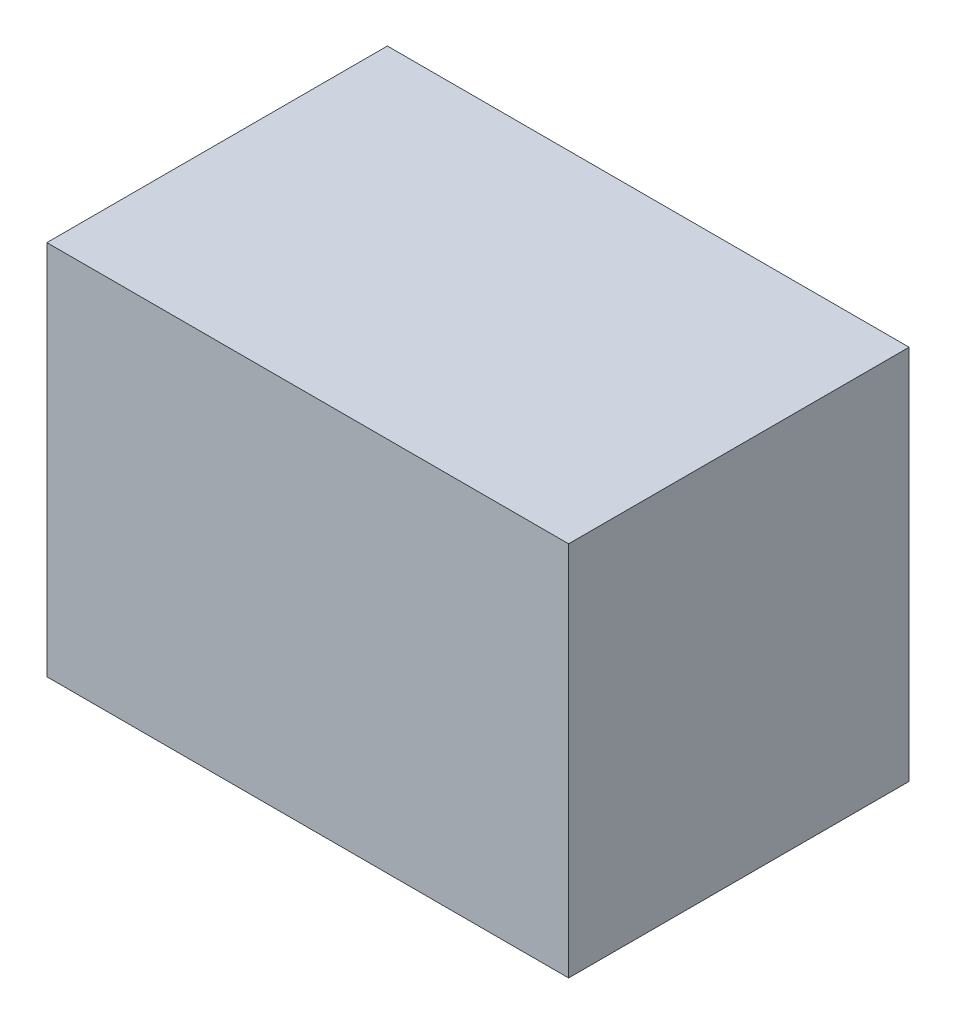
ISO-10303-21;
HEADER;
FILE_DESCRIPTION(('STEP AP214'),'2;1');
FILE_NAME('part.step','',(''),(''),'','','');
FILE_SCHEMA(('AUTOMOTIVE_DESIGN { 1 0 10303 214 1 1 1 1 }'));
ENDSEC;
DATA;
#1=APPLICATION_CONTEXT('core data for automotive mechanical design processes');
#2=APPLICATION_PROTOCOL_DEFINITION('international standard','automotive_design',2000,#1);
#3=PRODUCT_CONTEXT('',#1,'mechanical');
#4=PRODUCT('Part','Part','',(#3));
#5=PRODUCT_RELATED_PRODUCT_CATEGORY('part','',(#4));
#6=PRODUCT_DEFINITION_FORMATION('','',#4);
#7=PRODUCT_DEFINITION_CONTEXT('part definition',#1,'design');
#8=PRODUCT_DEFINITION('design','',#6,#7);
#9=PRODUCT_DEFINITION_SHAPE('','',#8);
#10=(LENGTH_UNIT() NAMED_UNIT(*) SI_UNIT(.MILLI.,.METRE.));
#11=(NAMED_UNIT(*) PLANE_ANGLE_UNIT() SI_UNIT($,.RADIAN.));
#12=(NAMED_UNIT(*) SI_UNIT($,.STERADIAN.) SOLID_ANGLE_UNIT());
#13=UNCERTAINTY_MEASURE_WITH_UNIT(LENGTH_MEASURE(1.E-05),#10,'distance_accuracy_value','');
#14=(GEOMETRIC_REPRESENTATION_CONTEXT(3) GLOBAL_UNCERTAINTY_ASSIGNED_CONTEXT((#13)) GLOBAL_UNIT_ASSIGNED_CONTEXT((#10,
#11,#12)) REPRESENTATION_CONTEXT('',''));
#15=CARTESIAN_POINT('',(0.,0.,0.));
#16=DIRECTION('',(0.,0.,1.));
#17=DIRECTION('',(1.,0.,0.));
#18=AXIS2_PLACEMENT_3D('',#15,#16,#17);
#19=CARTESIAN_POINT('',(-3.52425,-2.54,4.60000096));
#20=DIRECTION('',(0.,0.,1.));
#21=DIRECTION('',(1.,0.,0.));
#22=AXIS2_PLACEMENT_3D('',#19,#20,#21);
#23=PLANE('',#22);
#24=DIRECTION('',(1.,0.,0.));
#25=VECTOR('',#24,1.);
#26=CARTESIAN_POINT('',(-3.52425,2.54,4.60000096));
#27=LINE('',#26,#25);
#28=CARTESIAN_POINT('',(-3.52425,2.54,4.60000096));
#29=VERTEX_POINT('',#28);
#30=CARTESIAN_POINT('',(3.52425,2.54,4.60000096));
#31=VERTEX_POINT('',#30);
#32=EDGE_CURVE('E53',#29,#31,#27,.T.);
#33=ORIENTED_EDGE('',*,*,#32,.F.);
#34=DIRECTION('',(0.,1.,0.));
#35=VECTOR('',#34,1.);
#36=CARTESIAN_POINT('',(-3.52425,-2.54,4.60000096));
#37=LINE('',#36,#35);
#38=CARTESIAN_POINT('',(-3.52425,-2.54,4.60000096));
#39=VERTEX_POINT('',#38);
#40=EDGE_CURVE('E68',#39,#29,#37,.T.);
#41=ORIENTED_EDGE('',*,*,#40,.F.);
#42=DIRECTION('',(1.,0.,0.));
#43=VECTOR('',#42,1.);
#44=CARTESIAN_POINT('',(3.52425,-2.54,4.60000096));
#45=LINE('',#44,#43);
#46=CARTESIAN_POINT('',(3.52425,-2.54,4.60000096));
#47=VERTEX_POINT('',#46);
#48=EDGE_CURVE('E20',#47,#39,#45,.F.);
#49=ORIENTED_EDGE('',*,*,#48,.F.);
#50=DIRECTION('',(0.,1.,0.));
#51=VECTOR('',#50,1.);
#52=CARTESIAN_POINT('',(3.52425,2.54,4.60000096));
#53=LINE('',#52,#51);
#54=EDGE_CURVE('E58',#31,#47,#53,.F.);
#55=ORIENTED_EDGE('',*,*,#54,.F.);
#56=EDGE_LOOP('',(#33,#41,#49,#55));
#57=FACE_BOUND('',#56,.T.);
#58=ADVANCED_FACE('F17',(#57),#23,.T.);
#59=CARTESIAN_POINT('',(3.52425,-2.54,0.));
#60=DIRECTION('',(0.,-1.,0.));
#61=DIRECTION('',(0.,0.,-1.));
#62=AXIS2_PLACEMENT_3D('',#59,#60,#61);
#63=PLANE('',#62);
#64=DIRECTION('',(0.,0.,1.));
#65=VECTOR('',#64,1.);
#66=CARTESIAN_POINT('',(-3.52425,-2.54,0.));
#67=LINE('',#66,#65);
#68=CARTESIAN_POINT('',(-3.52425,-2.54,0.));
#69=VERTEX_POINT('',#68);
#70=EDGE_CURVE('E79',#69,#39,#67,.T.);
#71=ORIENTED_EDGE('',*,*,#70,.F.);
#72=DIRECTION('',(1.,0.,0.));
#73=VECTOR('',#72,1.);
#74=CARTESIAN_POINT('',(-3.52425,-2.54,0.));
#75=LINE('',#74,#73);
#76=CARTESIAN_POINT('',(3.52425,-2.54,0.));
#77=VERTEX_POINT('',#76);
#78=EDGE_CURVE('E74',#69,#77,#75,.T.);
#79=ORIENTED_EDGE('',*,*,#78,.T.);
#80=DIRECTION('',(0.,0.,-1.));
#81=VECTOR('',#80,1.);
#82=CARTESIAN_POINT('',(3.52425,-2.54,0.));
#83=LINE('',#82,#81);
#84=EDGE_CURVE('E63',#47,#77,#83,.T.);
#85=ORIENTED_EDGE('',*,*,#84,.F.);
#86=ORIENTED_EDGE('',*,*,#48,.T.);
#87=EDGE_LOOP('',(#71,#79,#85,#86));
#88=FACE_BOUND('',#87,.T.);
#89=ADVANCED_FACE('F73',(#88),#63,.T.);
#90=CARTESIAN_POINT('',(3.52425,2.54,0.));
#91=DIRECTION('',(1.,0.,0.));
#92=DIRECTION('',(0.,0.,-1.));
#93=AXIS2_PLACEMENT_3D('',#90,#91,#92);
#94=PLANE('',#93);
#95=ORIENTED_EDGE('',*,*,#84,.T.);
#96=DIRECTION('',(0.,1.,0.));
#97=VECTOR('',#96,1.);
#98=CARTESIAN_POINT('',(3.52425,-2.54,0.));
#99=LINE('',#98,#97);
#100=CARTESIAN_POINT('',(3.52425,2.54,0.));
#101=VERTEX_POINT('',#100);
#102=EDGE_CURVE('E84',#77,#101,#99,.T.);
#103=ORIENTED_EDGE('',*,*,#102,.T.);
#104=DIRECTION('',(0.,0.,1.));
#105=VECTOR('',#104,1.);
#106=CARTESIAN_POINT('',(3.52425,2.54,0.));
#107=LINE('',#106,#105);
#108=EDGE_CURVE('E65',#31,#101,#107,.F.);
#109=ORIENTED_EDGE('',*,*,#108,.F.);
#110=ORIENTED_EDGE('',*,*,#54,.T.);
#111=EDGE_LOOP('',(#95,#103,#109,#110));
#112=FACE_BOUND('',#111,.T.);
#113=ADVANCED_FACE('F60',(#112),#94,.T.);
#114=CARTESIAN_POINT('',(-3.52425,2.54,0.));
#115=DIRECTION('',(0.,1.,0.));
#116=DIRECTION('',(0.,0.,1.));
#117=AXIS2_PLACEMENT_3D('',#114,#115,#116);
#118=PLANE('',#117);
#119=ORIENTED_EDGE('',*,*,#108,.T.);
#120=DIRECTION('',(1.,0.,0.));
#121=VECTOR('',#120,1.);
#122=CARTESIAN_POINT('',(-3.52425,2.54,0.));
#123=LINE('',#122,#121);
#124=CARTESIAN_POINT('',(-3.52425,2.54,0.));
#125=VERTEX_POINT('',#124);
#126=EDGE_CURVE('E26',#101,#125,#123,.F.);
#127=ORIENTED_EDGE('',*,*,#126,.T.);
#128=DIRECTION('',(0.,0.,1.));
#129=VECTOR('',#128,1.);
#130=CARTESIAN_POINT('',(-3.52425,2.54,0.));
#131=LINE('',#130,#129);
#132=EDGE_CURVE('E34',#29,#125,#131,.F.);
#133=ORIENTED_EDGE('',*,*,#132,.F.);
#134=ORIENTED_EDGE('',*,*,#32,.T.);
#135=EDGE_LOOP('',(#119,#127,#133,#134));
#136=FACE_BOUND('',#135,.T.);
#137=ADVANCED_FACE('F88',(#136),#118,.T.);
#138=CARTESIAN_POINT('',(-3.52425,-2.54,0.));
#139=DIRECTION('',(-1.,0.,0.));
#140=DIRECTION('',(0.,0.,1.));
#141=AXIS2_PLACEMENT_3D('',#138,#139,#140);
#142=PLANE('',#141);
#143=ORIENTED_EDGE('',*,*,#132,.T.);
#144=DIRECTION('',(0.,1.,0.));
#145=VECTOR('',#144,1.);
#146=CARTESIAN_POINT('',(-3.52425,-2.54,0.));
#147=LINE('',#146,#145);
#148=EDGE_CURVE('E11',#125,#69,#147,.F.);
#149=ORIENTED_EDGE('',*,*,#148,.T.);
#150=ORIENTED_EDGE('',*,*,#70,.T.);
#151=ORIENTED_EDGE('',*,*,#40,.T.);
#152=EDGE_LOOP('',(#143,#149,#150,#151));
#153=FACE_BOUND('',#152,.T.);
#154=ADVANCED_FACE('F91',(#153),#142,.T.);
#155=CARTESIAN_POINT('',(-3.52425,-2.54,0.));
#156=DIRECTION('',(0.,0.,1.));
#157=DIRECTION('',(1.,0.,0.));
#158=AXIS2_PLACEMENT_3D('',#155,#156,#157);
#159=PLANE('',#158);
#160=ORIENTED_EDGE('',*,*,#126,.F.);
#161=ORIENTED_EDGE('',*,*,#102,.F.);
#162=ORIENTED_EDGE('',*,*,#78,.F.);
#163=ORIENTED_EDGE('',*,*,#148,.F.);
#164=EDGE_LOOP('',(#160,#161,#162,#163));
#165=FACE_BOUND('',#164,.T.);
#166=ADVANCED_FACE('F90',(#165),#159,.F.);
#167=CLOSED_SHELL('',(#58,#89,#113,#137,#154,#166));
#168=MANIFOLD_SOLID_BREP('B1',#167);
#169=ADVANCED_BREP_SHAPE_REPRESENTATION('',(#18,#168),#14);
#170=SHAPE_DEFINITION_REPRESENTATION(#9,#169);
ENDSEC;
END-ISO-10303-21;
